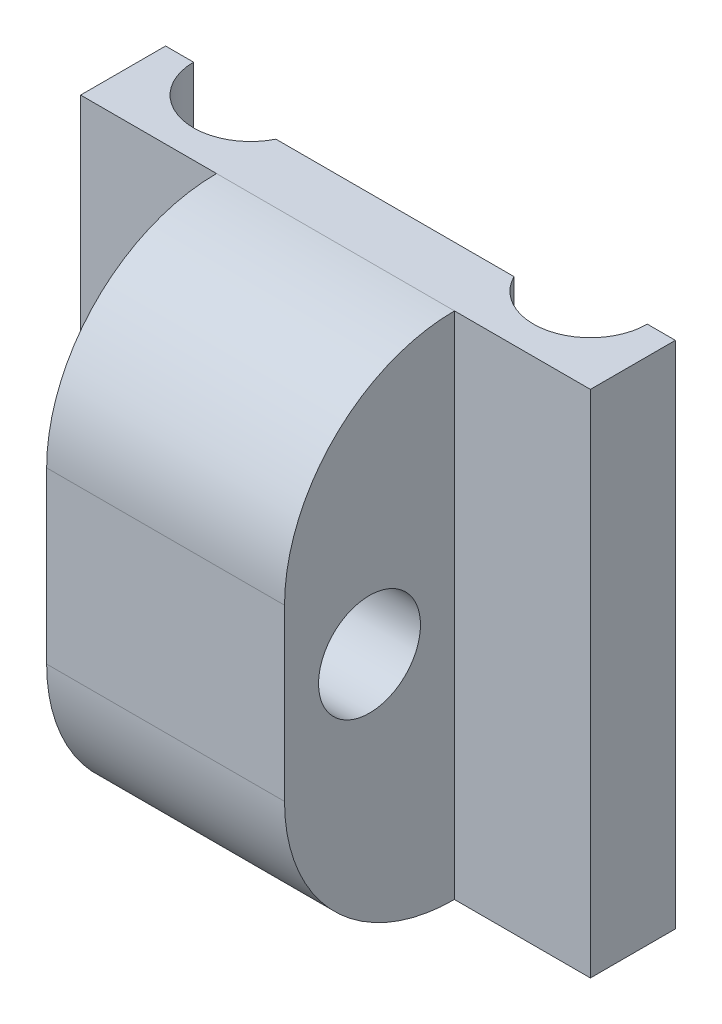
ISO-10303-21;
HEADER;
FILE_DESCRIPTION(('STEP AP214'),'2;1');
FILE_NAME('part.step','',(''),(''),'','','');
FILE_SCHEMA(('AUTOMOTIVE_DESIGN { 1 0 10303 214 1 1 1 1 }'));
ENDSEC;
DATA;
#1=APPLICATION_CONTEXT('core data for automotive mechanical design processes');
#2=APPLICATION_PROTOCOL_DEFINITION('international standard','automotive_design',2000,#1);
#3=PRODUCT_CONTEXT('',#1,'mechanical');
#4=PRODUCT('Part','Part','',(#3));
#5=PRODUCT_RELATED_PRODUCT_CATEGORY('part','',(#4));
#6=PRODUCT_DEFINITION_FORMATION('','',#4);
#7=PRODUCT_DEFINITION_CONTEXT('part definition',#1,'design');
#8=PRODUCT_DEFINITION('design','',#6,#7);
#9=PRODUCT_DEFINITION_SHAPE('','',#8);
#10=(LENGTH_UNIT() NAMED_UNIT(*) SI_UNIT(.MILLI.,.METRE.));
#11=(NAMED_UNIT(*) PLANE_ANGLE_UNIT() SI_UNIT($,.RADIAN.));
#12=(NAMED_UNIT(*) SI_UNIT($,.STERADIAN.) SOLID_ANGLE_UNIT());
#13=UNCERTAINTY_MEASURE_WITH_UNIT(LENGTH_MEASURE(1.E-05),#10,'distance_accuracy_value','');
#14=(GEOMETRIC_REPRESENTATION_CONTEXT(3) GLOBAL_UNCERTAINTY_ASSIGNED_CONTEXT((#13)) GLOBAL_UNIT_ASSIGNED_CONTEXT((#10,
#11,#12)) REPRESENTATION_CONTEXT('',''));
#15=CARTESIAN_POINT('',(0.,0.,0.));
#16=DIRECTION('',(0.,0.,1.));
#17=DIRECTION('',(1.,0.,0.));
#18=AXIS2_PLACEMENT_3D('',#15,#16,#17);
#19=CARTESIAN_POINT('',(0.,30.,0.));
#20=DIRECTION('',(1.,0.,0.));
#21=DIRECTION('',(0.,0.,-1.));
#22=AXIS2_PLACEMENT_3D('',#19,#20,#21);
#23=PLANE('',#22);
#24=DIRECTION('',(0.,0.,1.));
#25=VECTOR('',#24,1.);
#26=CARTESIAN_POINT('',(0.,0.,0.));
#27=LINE('',#26,#25);
#28=CARTESIAN_POINT('',(0.,0.,-15.));
#29=VERTEX_POINT('',#28);
#30=CARTESIAN_POINT('',(0.,0.,-10.));
#31=VERTEX_POINT('',#30);
#32=EDGE_CURVE('E143',#29,#31,#27,.T.);
#33=ORIENTED_EDGE('',*,*,#32,.T.);
#34=DIRECTION('',(0.,-1.,0.));
#35=VECTOR('',#34,1.);
#36=CARTESIAN_POINT('',(0.,30.,-10.));
#37=LINE('',#36,#35);
#38=CARTESIAN_POINT('',(0.,30.,-10.));
#39=VERTEX_POINT('',#38);
#40=EDGE_CURVE('E62',#39,#31,#37,.T.);
#41=ORIENTED_EDGE('',*,*,#40,.F.);
#42=DIRECTION('',(0.,0.,1.));
#43=VECTOR('',#42,1.);
#44=CARTESIAN_POINT('',(0.,30.,0.));
#45=LINE('',#44,#43);
#46=CARTESIAN_POINT('',(0.,30.,-15.));
#47=VERTEX_POINT('',#46);
#48=EDGE_CURVE('E141',#47,#39,#45,.T.);
#49=ORIENTED_EDGE('',*,*,#48,.F.);
#50=DIRECTION('',(0.,-1.,0.));
#51=VECTOR('',#50,1.);
#52=CARTESIAN_POINT('',(0.,30.,-15.));
#53=LINE('',#52,#51);
#54=EDGE_CURVE('E168',#47,#29,#53,.T.);
#55=ORIENTED_EDGE('',*,*,#54,.T.);
#56=EDGE_LOOP('',(#33,#41,#49,#55));
#57=FACE_BOUND('',#56,.T.);
#58=ADVANCED_FACE('F39',(#57),#23,.F.);
#59=CARTESIAN_POINT('',(0.,30.,0.));
#60=DIRECTION('',(0.,0.,-1.));
#61=DIRECTION('',(-1.,0.,0.));
#62=AXIS2_PLACEMENT_3D('',#59,#60,#61);
#63=PLANE('',#62);
#64=DIRECTION('',(1.,0.,0.));
#65=VECTOR('',#64,1.);
#66=CARTESIAN_POINT('',(0.,20.,0.));
#67=LINE('',#66,#65);
#68=CARTESIAN_POINT('',(22.,20.,0.));
#69=VERTEX_POINT('',#68);
#70=CARTESIAN_POINT('',(8.,20.,0.));
#71=VERTEX_POINT('',#70);
#72=EDGE_CURVE('E193',#69,#71,#67,.F.);
#73=ORIENTED_EDGE('',*,*,#72,.T.);
#74=DIRECTION('',(0.,-1.,0.));
#75=VECTOR('',#74,1.);
#76=CARTESIAN_POINT('',(8.,30.,0.));
#77=LINE('',#76,#75);
#78=CARTESIAN_POINT('',(8.,10.,0.));
#79=VERTEX_POINT('',#78);
#80=EDGE_CURVE('E239',#71,#79,#77,.T.);
#81=ORIENTED_EDGE('',*,*,#80,.T.);
#82=DIRECTION('',(1.,0.,0.));
#83=VECTOR('',#82,1.);
#84=CARTESIAN_POINT('',(0.,10.,0.));
#85=LINE('',#84,#83);
#86=CARTESIAN_POINT('',(22.,10.,0.));
#87=VERTEX_POINT('',#86);
#88=EDGE_CURVE('E134',#79,#87,#85,.T.);
#89=ORIENTED_EDGE('',*,*,#88,.T.);
#90=DIRECTION('',(0.,-1.,0.));
#91=VECTOR('',#90,1.);
#92=CARTESIAN_POINT('',(22.,30.,0.));
#93=LINE('',#92,#91);
#94=EDGE_CURVE('E54',#69,#87,#93,.T.);
#95=ORIENTED_EDGE('',*,*,#94,.F.);
#96=EDGE_LOOP('',(#73,#81,#89,#95));
#97=FACE_BOUND('',#96,.T.);
#98=ADVANCED_FACE('F271',(#97),#63,.F.);
#99=CARTESIAN_POINT('',(30.,30.,0.));
#100=DIRECTION('',(-1.,0.,0.));
#101=DIRECTION('',(0.,0.,1.));
#102=AXIS2_PLACEMENT_3D('',#99,#100,#101);
#103=PLANE('',#102);
#104=DIRECTION('',(0.,0.,-1.));
#105=VECTOR('',#104,1.);
#106=CARTESIAN_POINT('',(30.,30.,0.));
#107=LINE('',#106,#105);
#108=CARTESIAN_POINT('',(30.,30.,-10.));
#109=VERTEX_POINT('',#108);
#110=CARTESIAN_POINT('',(30.,30.,-15.));
#111=VERTEX_POINT('',#110);
#112=EDGE_CURVE('E150',#109,#111,#107,.T.);
#113=ORIENTED_EDGE('',*,*,#112,.F.);
#114=DIRECTION('',(0.,-1.,0.));
#115=VECTOR('',#114,1.);
#116=CARTESIAN_POINT('',(30.,30.,-10.));
#117=LINE('',#116,#115);
#118=CARTESIAN_POINT('',(30.,0.,-10.));
#119=VERTEX_POINT('',#118);
#120=EDGE_CURVE('E213',#109,#119,#117,.T.);
#121=ORIENTED_EDGE('',*,*,#120,.T.);
#122=DIRECTION('',(0.,0.,-1.));
#123=VECTOR('',#122,1.);
#124=CARTESIAN_POINT('',(30.,0.,0.));
#125=LINE('',#124,#123);
#126=CARTESIAN_POINT('',(30.,0.,-15.));
#127=VERTEX_POINT('',#126);
#128=EDGE_CURVE('E170',#119,#127,#125,.T.);
#129=ORIENTED_EDGE('',*,*,#128,.T.);
#130=DIRECTION('',(0.,-1.,0.));
#131=VECTOR('',#130,1.);
#132=CARTESIAN_POINT('',(30.,30.,-15.));
#133=LINE('',#132,#131);
#134=EDGE_CURVE('E185',#111,#127,#133,.T.);
#135=ORIENTED_EDGE('',*,*,#134,.F.);
#136=EDGE_LOOP('',(#113,#121,#129,#135));
#137=FACE_BOUND('',#136,.T.);
#138=ADVANCED_FACE('F225',(#137),#103,.F.);
#139=CARTESIAN_POINT('',(28.35,30.,-15.));
#140=DIRECTION('',(0.,0.,1.));
#141=DIRECTION('',(1.,0.,0.));
#142=AXIS2_PLACEMENT_3D('',#139,#140,#141);
#143=PLANE('',#142);
#144=DIRECTION('',(-1.,0.,0.));
#145=VECTOR('',#144,1.);
#146=CARTESIAN_POINT('',(28.35,0.,-15.));
#147=LINE('',#146,#145);
#148=CARTESIAN_POINT('',(28.35,0.,-15.));
#149=VERTEX_POINT('',#148);
#150=EDGE_CURVE('E172',#127,#149,#147,.T.);
#151=ORIENTED_EDGE('',*,*,#150,.T.);
#152=DIRECTION('',(0.,-1.,0.));
#153=VECTOR('',#152,1.);
#154=CARTESIAN_POINT('',(28.35,30.,-15.));
#155=LINE('',#154,#153);
#156=CARTESIAN_POINT('',(28.35,30.,-15.));
#157=VERTEX_POINT('',#156);
#158=EDGE_CURVE('E182',#157,#149,#155,.T.);
#159=ORIENTED_EDGE('',*,*,#158,.F.);
#160=DIRECTION('',(-1.,0.,0.));
#161=VECTOR('',#160,1.);
#162=CARTESIAN_POINT('',(28.35,30.,-15.));
#163=LINE('',#162,#161);
#164=EDGE_CURVE('E153',#111,#157,#163,.T.);
#165=ORIENTED_EDGE('',*,*,#164,.F.);
#166=ORIENTED_EDGE('',*,*,#134,.T.);
#167=EDGE_LOOP('',(#151,#159,#165,#166));
#168=FACE_BOUND('',#167,.T.);
#169=ADVANCED_FACE('F228',(#168),#143,.F.);
#170=CARTESIAN_POINT('',(25.,30.,-15.));
#171=DIRECTION('',(0.,-1.,0.));
#172=DIRECTION('',(0.,0.,-1.));
#173=AXIS2_PLACEMENT_3D('',#170,#171,#172);
#174=CYLINDRICAL_SURFACE('',#173,3.35000000000001);
#175=CARTESIAN_POINT('',(25.,0.,-15.));
#176=DIRECTION('',(0.,-1.,0.));
#177=DIRECTION('',(0.,0.,1.));
#178=AXIS2_PLACEMENT_3D('',#175,#176,#177);
#179=CIRCLE('',#178,3.35000000000001);
#180=CARTESIAN_POINT('',(22.00458683985,0.,-13.5));
#181=VERTEX_POINT('',#180);
#182=EDGE_CURVE('E174',#149,#181,#179,.T.);
#183=ORIENTED_EDGE('',*,*,#182,.T.);
#184=DIRECTION('',(0.,-1.,0.));
#185=VECTOR('',#184,1.);
#186=CARTESIAN_POINT('',(22.00458683985,30.,-13.5));
#187=LINE('',#186,#185);
#188=CARTESIAN_POINT('',(22.00458683985,30.,-13.5));
#189=VERTEX_POINT('',#188);
#190=EDGE_CURVE('E158',#181,#189,#187,.F.);
#191=ORIENTED_EDGE('',*,*,#190,.T.);
#192=CARTESIAN_POINT('',(25.,30.,-15.));
#193=DIRECTION('',(0.,-1.,0.));
#194=DIRECTION('',(0.,0.,1.));
#195=AXIS2_PLACEMENT_3D('',#192,#193,#194);
#196=CIRCLE('',#195,3.35000000000001);
#197=EDGE_CURVE('E162',#157,#189,#196,.T.);
#198=ORIENTED_EDGE('',*,*,#197,.F.);
#199=ORIENTED_EDGE('',*,*,#158,.T.);
#200=EDGE_LOOP('',(#183,#191,#198,#199));
#201=FACE_BOUND('',#200,.T.);
#202=ADVANCED_FACE('F255',(#201),#174,.F.);
#203=CARTESIAN_POINT('',(5.,30.,-15.));
#204=DIRECTION('',(0.,-1.,0.));
#205=DIRECTION('',(0.,0.,-1.));
#206=AXIS2_PLACEMENT_3D('',#203,#204,#205);
#207=CYLINDRICAL_SURFACE('',#206,3.35);
#208=CARTESIAN_POINT('',(5.,30.,-15.));
#209=DIRECTION('',(0.,-1.,0.));
#210=DIRECTION('',(0.,0.,1.));
#211=AXIS2_PLACEMENT_3D('',#208,#209,#210);
#212=CIRCLE('',#211,3.35);
#213=CARTESIAN_POINT('',(7.99541316015003,30.,-13.5));
#214=VERTEX_POINT('',#213);
#215=CARTESIAN_POINT('',(1.65,30.,-15.));
#216=VERTEX_POINT('',#215);
#217=EDGE_CURVE('E165',#214,#216,#212,.T.);
#218=ORIENTED_EDGE('',*,*,#217,.F.);
#219=DIRECTION('',(0.,-1.,0.));
#220=VECTOR('',#219,1.);
#221=CARTESIAN_POINT('',(7.99541316015003,30.,-13.5));
#222=LINE('',#221,#220);
#223=CARTESIAN_POINT('',(7.99541316015003,0.,-13.5));
#224=VERTEX_POINT('',#223);
#225=EDGE_CURVE('E248',#214,#224,#222,.T.);
#226=ORIENTED_EDGE('',*,*,#225,.T.);
#227=CARTESIAN_POINT('',(5.,0.,-15.));
#228=DIRECTION('',(0.,-1.,0.));
#229=DIRECTION('',(0.,0.,1.));
#230=AXIS2_PLACEMENT_3D('',#227,#228,#229);
#231=CIRCLE('',#230,3.35);
#232=CARTESIAN_POINT('',(1.65,0.,-15.));
#233=VERTEX_POINT('',#232);
#234=EDGE_CURVE('E155',#224,#233,#231,.T.);
#235=ORIENTED_EDGE('',*,*,#234,.T.);
#236=DIRECTION('',(0.,-1.,0.));
#237=VECTOR('',#236,1.);
#238=CARTESIAN_POINT('',(1.65,30.,-15.));
#239=LINE('',#238,#237);
#240=EDGE_CURVE('E179',#216,#233,#239,.T.);
#241=ORIENTED_EDGE('',*,*,#240,.F.);
#242=EDGE_LOOP('',(#218,#226,#235,#241));
#243=FACE_BOUND('',#242,.T.);
#244=ADVANCED_FACE('F260',(#243),#207,.F.);
#245=CARTESIAN_POINT('',(0.,30.,-15.));
#246=DIRECTION('',(0.,0.,1.));
#247=DIRECTION('',(1.,0.,0.));
#248=AXIS2_PLACEMENT_3D('',#245,#246,#247);
#249=PLANE('',#248);
#250=DIRECTION('',(-1.,0.,0.));
#251=VECTOR('',#250,1.);
#252=CARTESIAN_POINT('',(0.,0.,-15.));
#253=LINE('',#252,#251);
#254=EDGE_CURVE('E151',#233,#29,#253,.T.);
#255=ORIENTED_EDGE('',*,*,#254,.T.);
#256=ORIENTED_EDGE('',*,*,#54,.F.);
#257=DIRECTION('',(-1.,0.,0.));
#258=VECTOR('',#257,1.);
#259=CARTESIAN_POINT('',(0.,30.,-15.));
#260=LINE('',#259,#258);
#261=EDGE_CURVE('E148',#216,#47,#260,.T.);
#262=ORIENTED_EDGE('',*,*,#261,.F.);
#263=ORIENTED_EDGE('',*,*,#240,.T.);
#264=EDGE_LOOP('',(#255,#256,#262,#263));
#265=FACE_BOUND('',#264,.T.);
#266=ADVANCED_FACE('F262',(#265),#249,.F.);
#267=CARTESIAN_POINT('',(5.,30.,-15.));
#268=DIRECTION('',(0.,1.,0.));
#269=DIRECTION('',(0.,0.,1.));
#270=AXIS2_PLACEMENT_3D('',#267,#268,#269);
#271=PLANE('',#270);
#272=ORIENTED_EDGE('',*,*,#48,.T.);
#273=DIRECTION('',(1.,0.,0.));
#274=VECTOR('',#273,1.);
#275=CARTESIAN_POINT('',(30.,30.,-10.));
#276=LINE('',#275,#274);
#277=CARTESIAN_POINT('',(8.,30.,-10.));
#278=VERTEX_POINT('',#277);
#279=EDGE_CURVE('E126',#39,#278,#276,.T.);
#280=ORIENTED_EDGE('',*,*,#279,.T.);
#281=CARTESIAN_POINT('',(22.,30.,-10.));
#282=VERTEX_POINT('',#281);
#283=EDGE_CURVE('E135',#278,#282,#276,.T.);
#284=ORIENTED_EDGE('',*,*,#283,.T.);
#285=DIRECTION('',(1.,0.,0.));
#286=VECTOR('',#285,1.);
#287=CARTESIAN_POINT('',(30.,30.,-10.));
#288=LINE('',#287,#286);
#289=EDGE_CURVE('E144',#282,#109,#288,.T.);
#290=ORIENTED_EDGE('',*,*,#289,.T.);
#291=ORIENTED_EDGE('',*,*,#112,.T.);
#292=ORIENTED_EDGE('',*,*,#164,.T.);
#293=ORIENTED_EDGE('',*,*,#197,.T.);
#294=DIRECTION('',(-1.,0.,0.));
#295=VECTOR('',#294,1.);
#296=CARTESIAN_POINT('',(6.7784951661019,30.,-13.5));
#297=LINE('',#296,#295);
#298=EDGE_CURVE('E247',#189,#214,#297,.T.);
#299=ORIENTED_EDGE('',*,*,#298,.T.);
#300=ORIENTED_EDGE('',*,*,#217,.T.);
#301=ORIENTED_EDGE('',*,*,#261,.T.);
#302=EDGE_LOOP('',(#272,#280,#284,#290,#291,#292,#293,#299,#300,#301));
#303=FACE_BOUND('',#302,.T.);
#304=ADVANCED_FACE('F146',(#303),#271,.T.);
#305=CARTESIAN_POINT('',(5.,0.,-15.));
#306=DIRECTION('',(0.,1.,0.));
#307=DIRECTION('',(0.,0.,1.));
#308=AXIS2_PLACEMENT_3D('',#305,#306,#307);
#309=PLANE('',#308);
#310=ORIENTED_EDGE('',*,*,#128,.F.);
#311=DIRECTION('',(1.,0.,0.));
#312=VECTOR('',#311,1.);
#313=CARTESIAN_POINT('',(5.,0.,-10.));
#314=LINE('',#313,#312);
#315=CARTESIAN_POINT('',(22.,0.,-10.));
#316=VERTEX_POINT('',#315);
#317=EDGE_CURVE('E197',#119,#316,#314,.F.);
#318=ORIENTED_EDGE('',*,*,#317,.T.);
#319=CARTESIAN_POINT('',(8.,0.,-10.));
#320=VERTEX_POINT('',#319);
#321=EDGE_CURVE('E199',#316,#320,#314,.F.);
#322=ORIENTED_EDGE('',*,*,#321,.T.);
#323=EDGE_CURVE('E196',#320,#31,#314,.F.);
#324=ORIENTED_EDGE('',*,*,#323,.T.);
#325=ORIENTED_EDGE('',*,*,#32,.F.);
#326=ORIENTED_EDGE('',*,*,#254,.F.);
#327=ORIENTED_EDGE('',*,*,#234,.F.);
#328=DIRECTION('',(1.,0.,0.));
#329=VECTOR('',#328,1.);
#330=CARTESIAN_POINT('',(5.,0.,-13.5));
#331=LINE('',#330,#329);
#332=EDGE_CURVE('E188',#224,#181,#331,.T.);
#333=ORIENTED_EDGE('',*,*,#332,.T.);
#334=ORIENTED_EDGE('',*,*,#182,.F.);
#335=ORIENTED_EDGE('',*,*,#150,.F.);
#336=EDGE_LOOP('',(#310,#318,#322,#324,#325,#326,#327,#333,#334,#335));
#337=FACE_BOUND('',#336,.T.);
#338=ADVANCED_FACE('F219',(#337),#309,.F.);
#339=CARTESIAN_POINT('',(6.7784951661019,30.,-13.5));
#340=DIRECTION('',(0.,0.,1.));
#341=DIRECTION('',(1.,0.,0.));
#342=AXIS2_PLACEMENT_3D('',#339,#340,#341);
#343=PLANE('',#342);
#344=ORIENTED_EDGE('',*,*,#332,.F.);
#345=ORIENTED_EDGE('',*,*,#225,.F.);
#346=ORIENTED_EDGE('',*,*,#298,.F.);
#347=ORIENTED_EDGE('',*,*,#190,.F.);
#348=EDGE_LOOP('',(#344,#345,#346,#347));
#349=FACE_BOUND('',#348,.T.);
#350=ADVANCED_FACE('F257',(#349),#343,.F.);
#351=CARTESIAN_POINT('',(5.,20.,-10.));
#352=DIRECTION('',(-1.,0.,0.));
#353=DIRECTION('',(0.,0.,1.));
#354=AXIS2_PLACEMENT_3D('',#351,#352,#353);
#355=CYLINDRICAL_SURFACE('',#354,10.);
#356=CARTESIAN_POINT('',(8.,20.,-10.));
#357=DIRECTION('',(1.,0.,0.));
#358=DIRECTION('',(0.,0.,-1.));
#359=AXIS2_PLACEMENT_3D('',#356,#357,#358);
#360=CIRCLE('',#359,10.);
#361=EDGE_CURVE('E242',#71,#278,#360,.F.);
#362=ORIENTED_EDGE('',*,*,#361,.F.);
#363=ORIENTED_EDGE('',*,*,#72,.F.);
#364=CARTESIAN_POINT('',(22.,20.,-10.));
#365=DIRECTION('',(-1.,0.,0.));
#366=DIRECTION('',(0.,0.,1.));
#367=AXIS2_PLACEMENT_3D('',#364,#365,#366);
#368=CIRCLE('',#367,10.);
#369=EDGE_CURVE('E236',#282,#69,#368,.F.);
#370=ORIENTED_EDGE('',*,*,#369,.F.);
#371=ORIENTED_EDGE('',*,*,#283,.F.);
#372=EDGE_LOOP('',(#362,#363,#370,#371));
#373=FACE_BOUND('',#372,.T.);
#374=ADVANCED_FACE('F274',(#373),#355,.T.);
#375=CARTESIAN_POINT('',(0.,10.,-10.));
#376=DIRECTION('',(1.,0.,0.));
#377=DIRECTION('',(0.,0.,-1.));
#378=AXIS2_PLACEMENT_3D('',#375,#376,#377);
#379=CYLINDRICAL_SURFACE('',#378,10.);
#380=CARTESIAN_POINT('',(8.,10.,-10.));
#381=DIRECTION('',(1.,0.,0.));
#382=DIRECTION('',(0.,0.,-1.));
#383=AXIS2_PLACEMENT_3D('',#380,#381,#382);
#384=CIRCLE('',#383,10.);
#385=EDGE_CURVE('E11',#320,#79,#384,.F.);
#386=ORIENTED_EDGE('',*,*,#385,.F.);
#387=ORIENTED_EDGE('',*,*,#321,.F.);
#388=CARTESIAN_POINT('',(22.,10.,-10.));
#389=DIRECTION('',(-1.,0.,0.));
#390=DIRECTION('',(0.,0.,1.));
#391=AXIS2_PLACEMENT_3D('',#388,#389,#390);
#392=CIRCLE('',#391,10.);
#393=EDGE_CURVE('E47',#87,#316,#392,.F.);
#394=ORIENTED_EDGE('',*,*,#393,.F.);
#395=ORIENTED_EDGE('',*,*,#88,.F.);
#396=EDGE_LOOP('',(#386,#387,#394,#395));
#397=FACE_BOUND('',#396,.T.);
#398=ADVANCED_FACE('F41',(#397),#379,.T.);
#399=CARTESIAN_POINT('',(22.,30.,0.));
#400=DIRECTION('',(-1.,0.,0.));
#401=DIRECTION('',(0.,0.,1.));
#402=AXIS2_PLACEMENT_3D('',#399,#400,#401);
#403=PLANE('',#402);
#404=ORIENTED_EDGE('',*,*,#369,.T.);
#405=ORIENTED_EDGE('',*,*,#94,.T.);
#406=ORIENTED_EDGE('',*,*,#393,.T.);
#407=DIRECTION('',(0.,-1.,0.));
#408=VECTOR('',#407,1.);
#409=CARTESIAN_POINT('',(22.,30.,-10.));
#410=LINE('',#409,#408);
#411=EDGE_CURVE('E203',#282,#316,#410,.T.);
#412=ORIENTED_EDGE('',*,*,#411,.F.);
#413=EDGE_LOOP('',(#404,#405,#406,#412));
#414=FACE_BOUND('',#413,.T.);
#415=CARTESIAN_POINT('',(22.,15.,-5.));
#416=DIRECTION('',(-1.,0.,0.));
#417=DIRECTION('',(0.,0.,1.));
#418=AXIS2_PLACEMENT_3D('',#415,#416,#417);
#419=CIRCLE('',#418,3.);
#420=CARTESIAN_POINT('',(22.,15.,-2.));
#421=VERTEX_POINT('',#420);
#422=EDGE_CURVE('E238',#421,#421,#419,.F.);
#423=ORIENTED_EDGE('',*,*,#422,.F.);
#424=EDGE_LOOP('',(#423));
#425=FACE_BOUND('',#424,.T.);
#426=ADVANCED_FACE('F201',(#414,#425),#403,.F.);
#427=CARTESIAN_POINT('',(30.,30.,-10.));
#428=DIRECTION('',(0.,0.,-1.));
#429=DIRECTION('',(-1.,0.,0.));
#430=AXIS2_PLACEMENT_3D('',#427,#428,#429);
#431=PLANE('',#430);
#432=ORIENTED_EDGE('',*,*,#317,.F.);
#433=ORIENTED_EDGE('',*,*,#120,.F.);
#434=ORIENTED_EDGE('',*,*,#289,.F.);
#435=ORIENTED_EDGE('',*,*,#411,.T.);
#436=EDGE_LOOP('',(#432,#433,#434,#435));
#437=FACE_BOUND('',#436,.T.);
#438=ADVANCED_FACE('F209',(#437),#431,.F.);
#439=CARTESIAN_POINT('',(8.,30.,0.));
#440=DIRECTION('',(1.,0.,0.));
#441=DIRECTION('',(0.,0.,-1.));
#442=AXIS2_PLACEMENT_3D('',#439,#440,#441);
#443=PLANE('',#442);
#444=ORIENTED_EDGE('',*,*,#361,.T.);
#445=DIRECTION('',(0.,-1.,0.));
#446=VECTOR('',#445,1.);
#447=CARTESIAN_POINT('',(8.,30.,-10.));
#448=LINE('',#447,#446);
#449=EDGE_CURVE('E129',#278,#320,#448,.T.);
#450=ORIENTED_EDGE('',*,*,#449,.T.);
#451=ORIENTED_EDGE('',*,*,#385,.T.);
#452=ORIENTED_EDGE('',*,*,#80,.F.);
#453=EDGE_LOOP('',(#444,#450,#451,#452));
#454=FACE_BOUND('',#453,.T.);
#455=CARTESIAN_POINT('',(8.,15.,-5.));
#456=DIRECTION('',(1.,0.,0.));
#457=DIRECTION('',(0.,0.,-1.));
#458=AXIS2_PLACEMENT_3D('',#455,#456,#457);
#459=CIRCLE('',#458,3.);
#460=CARTESIAN_POINT('',(8.,15.,-8.));
#461=VERTEX_POINT('',#460);
#462=EDGE_CURVE('E244',#461,#461,#459,.F.);
#463=ORIENTED_EDGE('',*,*,#462,.F.);
#464=EDGE_LOOP('',(#463));
#465=FACE_BOUND('',#464,.T.);
#466=ADVANCED_FACE('F264',(#454,#465),#443,.F.);
#467=CARTESIAN_POINT('',(0.,30.,-10.));
#468=DIRECTION('',(0.,0.,-1.));
#469=DIRECTION('',(-1.,0.,0.));
#470=AXIS2_PLACEMENT_3D('',#467,#468,#469);
#471=PLANE('',#470);
#472=ORIENTED_EDGE('',*,*,#323,.F.);
#473=ORIENTED_EDGE('',*,*,#449,.F.);
#474=ORIENTED_EDGE('',*,*,#279,.F.);
#475=ORIENTED_EDGE('',*,*,#40,.T.);
#476=EDGE_LOOP('',(#472,#473,#474,#475));
#477=FACE_BOUND('',#476,.T.);
#478=ADVANCED_FACE('F127',(#477),#471,.F.);
#479=CARTESIAN_POINT('',(30.,15.,-5.));
#480=DIRECTION('',(-1.,0.,0.));
#481=DIRECTION('',(0.,0.,1.));
#482=AXIS2_PLACEMENT_3D('',#479,#480,#481);
#483=CYLINDRICAL_SURFACE('',#482,3.);
#484=ORIENTED_EDGE('',*,*,#462,.T.);
#485=EDGE_LOOP('',(#484));
#486=FACE_BOUND('',#485,.T.);
#487=ORIENTED_EDGE('',*,*,#422,.T.);
#488=EDGE_LOOP('',(#487));
#489=FACE_BOUND('',#488,.T.);
#490=ADVANCED_FACE('F302',(#486,#489),#483,.F.);
#491=CLOSED_SHELL('',(#58,#98,#138,#169,#202,#244,#266,#304,#338,#350,#374,#398,#426,#438,#466,
#478,#490));
#492=MANIFOLD_SOLID_BREP('B2',#491);
#493=ADVANCED_BREP_SHAPE_REPRESENTATION('',(#18,#492),#14);
#494=SHAPE_DEFINITION_REPRESENTATION(#9,#493);
ENDSEC;
END-ISO-10303-21;
